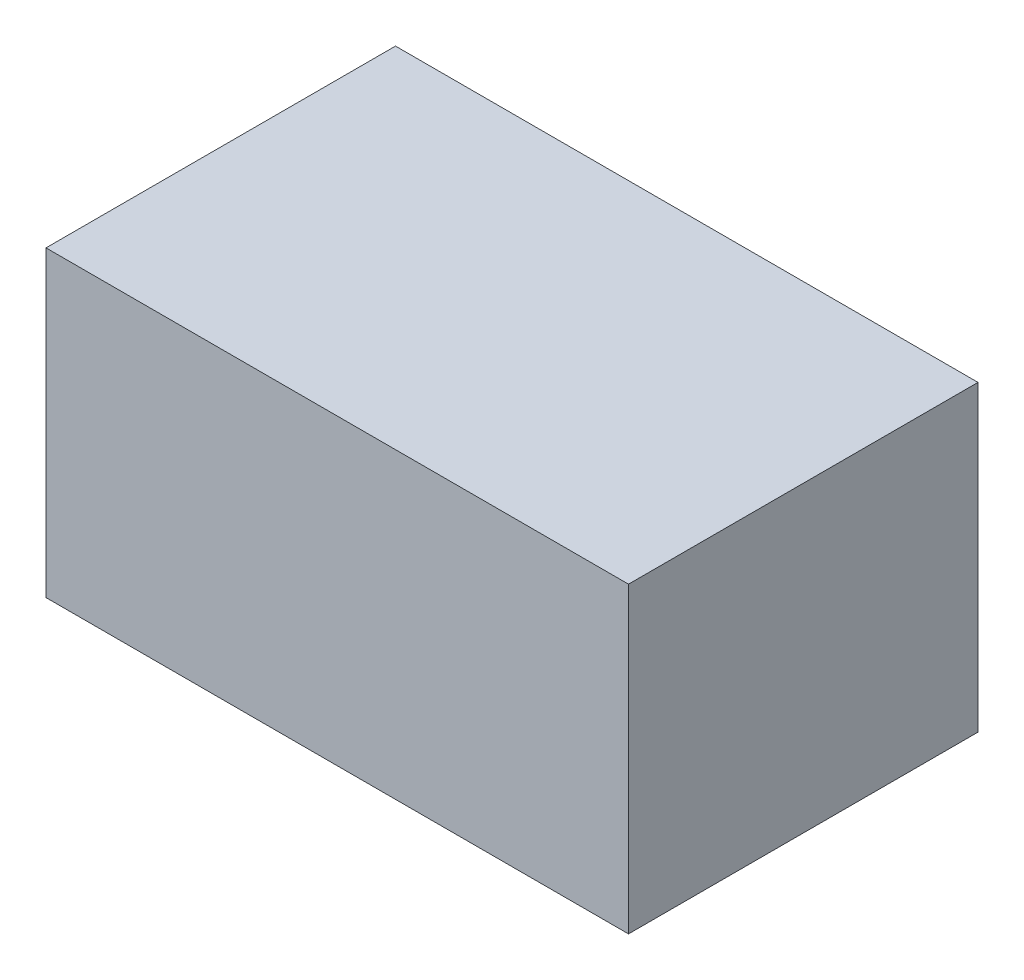
ISO-10303-21;
HEADER;
FILE_DESCRIPTION(('STEP AP214'),'2;1');
FILE_NAME('part.step','',(''),(''),'','','');
FILE_SCHEMA(('AUTOMOTIVE_DESIGN { 1 0 10303 214 1 1 1 1 }'));
ENDSEC;
DATA;
#1=APPLICATION_CONTEXT('core data for automotive mechanical design processes');
#2=APPLICATION_PROTOCOL_DEFINITION('international standard','automotive_design',2000,#1);
#3=PRODUCT_CONTEXT('',#1,'mechanical');
#4=PRODUCT('Part','Part','',(#3));
#5=PRODUCT_RELATED_PRODUCT_CATEGORY('part','',(#4));
#6=PRODUCT_DEFINITION_FORMATION('','',#4);
#7=PRODUCT_DEFINITION_CONTEXT('part definition',#1,'design');
#8=PRODUCT_DEFINITION('design','',#6,#7);
#9=PRODUCT_DEFINITION_SHAPE('','',#8);
#10=(LENGTH_UNIT() NAMED_UNIT(*) SI_UNIT(.MILLI.,.METRE.));
#11=(NAMED_UNIT(*) PLANE_ANGLE_UNIT() SI_UNIT($,.RADIAN.));
#12=(NAMED_UNIT(*) SI_UNIT($,.STERADIAN.) SOLID_ANGLE_UNIT());
#13=UNCERTAINTY_MEASURE_WITH_UNIT(LENGTH_MEASURE(1.E-05),#10,'distance_accuracy_value','');
#14=(GEOMETRIC_REPRESENTATION_CONTEXT(3) GLOBAL_UNCERTAINTY_ASSIGNED_CONTEXT((#13)) GLOBAL_UNIT_ASSIGNED_CONTEXT((#10,
#11,#12)) REPRESENTATION_CONTEXT('',''));
#15=CARTESIAN_POINT('',(0.,0.,0.));
#16=DIRECTION('',(0.,0.,1.));
#17=DIRECTION('',(1.,0.,0.));
#18=AXIS2_PLACEMENT_3D('',#15,#16,#17);
#19=CARTESIAN_POINT('',(125.,130.,75.));
#20=DIRECTION('',(-1.,0.,0.));
#21=DIRECTION('',(0.,0.,1.));
#22=AXIS2_PLACEMENT_3D('',#19,#20,#21);
#23=PLANE('',#22);
#24=DIRECTION('',(0.,0.,-1.));
#25=VECTOR('',#24,1.);
#26=CARTESIAN_POINT('',(125.,0.,75.));
#27=LINE('',#26,#25);
#28=CARTESIAN_POINT('',(125.,0.,75.));
#29=VERTEX_POINT('',#28);
#30=CARTESIAN_POINT('',(125.,0.,-75.));
#31=VERTEX_POINT('',#30);
#32=EDGE_CURVE('E104',#29,#31,#27,.T.);
#33=ORIENTED_EDGE('',*,*,#32,.T.);
#34=DIRECTION('',(0.,-1.,0.));
#35=VECTOR('',#34,1.);
#36=CARTESIAN_POINT('',(125.,130.,-75.));
#37=LINE('',#36,#35);
#38=CARTESIAN_POINT('',(125.,130.,-75.));
#39=VERTEX_POINT('',#38);
#40=EDGE_CURVE('E11',#39,#31,#37,.T.);
#41=ORIENTED_EDGE('',*,*,#40,.F.);
#42=DIRECTION('',(0.,0.,-1.));
#43=VECTOR('',#42,1.);
#44=CARTESIAN_POINT('',(125.,130.,75.));
#45=LINE('',#44,#43);
#46=CARTESIAN_POINT('',(125.,130.,75.));
#47=VERTEX_POINT('',#46);
#48=EDGE_CURVE('E92',#47,#39,#45,.T.);
#49=ORIENTED_EDGE('',*,*,#48,.F.);
#50=DIRECTION('',(0.,-1.,0.));
#51=VECTOR('',#50,1.);
#52=CARTESIAN_POINT('',(125.,130.,75.));
#53=LINE('',#52,#51);
#54=EDGE_CURVE('E100',#47,#29,#53,.T.);
#55=ORIENTED_EDGE('',*,*,#54,.T.);
#56=EDGE_LOOP('',(#33,#41,#49,#55));
#57=FACE_BOUND('',#56,.T.);
#58=ADVANCED_FACE('F41',(#57),#23,.F.);
#59=CARTESIAN_POINT('',(-125.,130.,-75.));
#60=DIRECTION('',(0.,0.,1.));
#61=DIRECTION('',(1.,0.,0.));
#62=AXIS2_PLACEMENT_3D('',#59,#60,#61);
#63=PLANE('',#62);
#64=DIRECTION('',(-1.,0.,0.));
#65=VECTOR('',#64,1.);
#66=CARTESIAN_POINT('',(-125.,0.,-75.));
#67=LINE('',#66,#65);
#68=CARTESIAN_POINT('',(-125.,0.,-75.));
#69=VERTEX_POINT('',#68);
#70=EDGE_CURVE('E96',#31,#69,#67,.T.);
#71=ORIENTED_EDGE('',*,*,#70,.T.);
#72=DIRECTION('',(0.,-1.,0.));
#73=VECTOR('',#72,1.);
#74=CARTESIAN_POINT('',(-125.,130.,-75.));
#75=LINE('',#74,#73);
#76=CARTESIAN_POINT('',(-125.,130.,-75.));
#77=VERTEX_POINT('',#76);
#78=EDGE_CURVE('E49',#77,#69,#75,.T.);
#79=ORIENTED_EDGE('',*,*,#78,.F.);
#80=DIRECTION('',(-1.,0.,0.));
#81=VECTOR('',#80,1.);
#82=CARTESIAN_POINT('',(-125.,130.,-75.));
#83=LINE('',#82,#81);
#84=EDGE_CURVE('E87',#39,#77,#83,.T.);
#85=ORIENTED_EDGE('',*,*,#84,.F.);
#86=ORIENTED_EDGE('',*,*,#40,.T.);
#87=EDGE_LOOP('',(#71,#79,#85,#86));
#88=FACE_BOUND('',#87,.T.);
#89=ADVANCED_FACE('F95',(#88),#63,.F.);
#90=CARTESIAN_POINT('',(-125.,130.,75.));
#91=DIRECTION('',(1.,0.,0.));
#92=DIRECTION('',(0.,0.,-1.));
#93=AXIS2_PLACEMENT_3D('',#90,#91,#92);
#94=PLANE('',#93);
#95=DIRECTION('',(0.,0.,1.));
#96=VECTOR('',#95,1.);
#97=CARTESIAN_POINT('',(-125.,0.,75.));
#98=LINE('',#97,#96);
#99=CARTESIAN_POINT('',(-125.,0.,75.));
#100=VERTEX_POINT('',#99);
#101=EDGE_CURVE('E74',#69,#100,#98,.T.);
#102=ORIENTED_EDGE('',*,*,#101,.T.);
#103=DIRECTION('',(0.,-1.,0.));
#104=VECTOR('',#103,1.);
#105=CARTESIAN_POINT('',(-125.,130.,75.));
#106=LINE('',#105,#104);
#107=CARTESIAN_POINT('',(-125.,130.,75.));
#108=VERTEX_POINT('',#107);
#109=EDGE_CURVE('E97',#108,#100,#106,.T.);
#110=ORIENTED_EDGE('',*,*,#109,.F.);
#111=DIRECTION('',(0.,0.,1.));
#112=VECTOR('',#111,1.);
#113=CARTESIAN_POINT('',(-125.,130.,75.));
#114=LINE('',#113,#112);
#115=EDGE_CURVE('E90',#77,#108,#114,.T.);
#116=ORIENTED_EDGE('',*,*,#115,.F.);
#117=ORIENTED_EDGE('',*,*,#78,.T.);
#118=EDGE_LOOP('',(#102,#110,#116,#117));
#119=FACE_BOUND('',#118,.T.);
#120=ADVANCED_FACE('F98',(#119),#94,.F.);
#121=CARTESIAN_POINT('',(-125.,130.,75.));
#122=DIRECTION('',(0.,0.,-1.));
#123=DIRECTION('',(-1.,0.,0.));
#124=AXIS2_PLACEMENT_3D('',#121,#122,#123);
#125=PLANE('',#124);
#126=DIRECTION('',(1.,0.,0.));
#127=VECTOR('',#126,1.);
#128=CARTESIAN_POINT('',(-125.,0.,75.));
#129=LINE('',#128,#127);
#130=EDGE_CURVE('E80',#100,#29,#129,.T.);
#131=ORIENTED_EDGE('',*,*,#130,.T.);
#132=ORIENTED_EDGE('',*,*,#54,.F.);
#133=DIRECTION('',(1.,0.,0.));
#134=VECTOR('',#133,1.);
#135=CARTESIAN_POINT('',(-125.,130.,75.));
#136=LINE('',#135,#134);
#137=EDGE_CURVE('E57',#108,#47,#136,.T.);
#138=ORIENTED_EDGE('',*,*,#137,.F.);
#139=ORIENTED_EDGE('',*,*,#109,.T.);
#140=EDGE_LOOP('',(#131,#132,#138,#139));
#141=FACE_BOUND('',#140,.T.);
#142=ADVANCED_FACE('F111',(#141),#125,.F.);
#143=CARTESIAN_POINT('',(0.,130.,0.));
#144=DIRECTION('',(0.,-1.,0.));
#145=DIRECTION('',(0.,0.,-1.));
#146=AXIS2_PLACEMENT_3D('',#143,#144,#145);
#147=PLANE('',#146);
#148=ORIENTED_EDGE('',*,*,#48,.T.);
#149=ORIENTED_EDGE('',*,*,#84,.T.);
#150=ORIENTED_EDGE('',*,*,#115,.T.);
#151=ORIENTED_EDGE('',*,*,#137,.T.);
#152=EDGE_LOOP('',(#148,#149,#150,#151));
#153=FACE_BOUND('',#152,.T.);
#154=ADVANCED_FACE('F88',(#153),#147,.F.);
#155=CARTESIAN_POINT('',(0.,0.,0.));
#156=DIRECTION('',(0.,-1.,0.));
#157=DIRECTION('',(0.,0.,-1.));
#158=AXIS2_PLACEMENT_3D('',#155,#156,#157);
#159=PLANE('',#158);
#160=ORIENTED_EDGE('',*,*,#32,.F.);
#161=ORIENTED_EDGE('',*,*,#130,.F.);
#162=ORIENTED_EDGE('',*,*,#101,.F.);
#163=ORIENTED_EDGE('',*,*,#70,.F.);
#164=EDGE_LOOP('',(#160,#161,#162,#163));
#165=FACE_BOUND('',#164,.T.);
#166=ADVANCED_FACE('F114',(#165),#159,.T.);
#167=CLOSED_SHELL('',(#58,#89,#120,#142,#154,#166));
#168=MANIFOLD_SOLID_BREP('B2',#167);
#169=ADVANCED_BREP_SHAPE_REPRESENTATION('',(#18,#168),#14);
#170=SHAPE_DEFINITION_REPRESENTATION(#9,#169);
ENDSEC;
END-ISO-10303-21;
